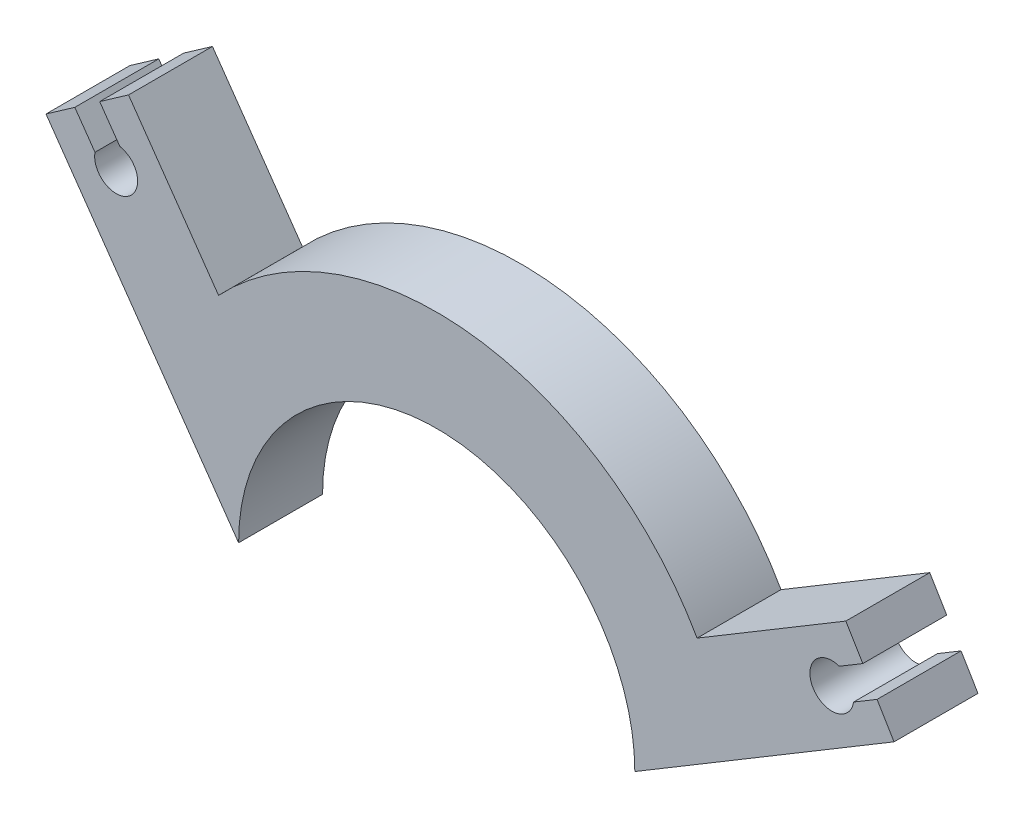
ISO-10303-21;
HEADER;
FILE_DESCRIPTION(('STEP AP214'),'2;1');
FILE_NAME('part.step','',(''),(''),'','','');
FILE_SCHEMA(('AUTOMOTIVE_DESIGN { 1 0 10303 214 1 1 1 1 }'));
ENDSEC;
DATA;
#1=APPLICATION_CONTEXT('core data for automotive mechanical design processes');
#2=APPLICATION_PROTOCOL_DEFINITION('international standard','automotive_design',2000,#1);
#3=PRODUCT_CONTEXT('',#1,'mechanical');
#4=PRODUCT('Part','Part','',(#3));
#5=PRODUCT_RELATED_PRODUCT_CATEGORY('part','',(#4));
#6=PRODUCT_DEFINITION_FORMATION('','',#4);
#7=PRODUCT_DEFINITION_CONTEXT('part definition',#1,'design');
#8=PRODUCT_DEFINITION('design','',#6,#7);
#9=PRODUCT_DEFINITION_SHAPE('','',#8);
#10=(LENGTH_UNIT() NAMED_UNIT(*) SI_UNIT(.MILLI.,.METRE.));
#11=(NAMED_UNIT(*) PLANE_ANGLE_UNIT() SI_UNIT($,.RADIAN.));
#12=(NAMED_UNIT(*) SI_UNIT($,.STERADIAN.) SOLID_ANGLE_UNIT());
#13=UNCERTAINTY_MEASURE_WITH_UNIT(LENGTH_MEASURE(1.E-05),#10,'distance_accuracy_value','');
#14=(GEOMETRIC_REPRESENTATION_CONTEXT(3) GLOBAL_UNCERTAINTY_ASSIGNED_CONTEXT((#13)) GLOBAL_UNIT_ASSIGNED_CONTEXT((#10,
#11,#12)) REPRESENTATION_CONTEXT('',''));
#15=CARTESIAN_POINT('',(0.,0.,0.));
#16=DIRECTION('',(0.,0.,1.));
#17=DIRECTION('',(1.,0.,0.));
#18=AXIS2_PLACEMENT_3D('',#15,#16,#17);
#19=CARTESIAN_POINT('',(0.,0.,1.5875));
#20=DIRECTION('',(0.,0.,-1.));
#21=DIRECTION('',(-1.,0.,0.));
#22=AXIS2_PLACEMENT_3D('',#19,#20,#21);
#23=CYLINDRICAL_SURFACE('',#22,3.7465);
#24=CARTESIAN_POINT('',(0.,0.,0.));
#25=DIRECTION('',(0.,0.,-1.));
#26=DIRECTION('',(1.,0.,0.));
#27=AXIS2_PLACEMENT_3D('',#24,#25,#26);
#28=CIRCLE('',#27,3.7465);
#29=CARTESIAN_POINT('',(-3.7465,0.,0.));
#30=VERTEX_POINT('',#29);
#31=CARTESIAN_POINT('',(3.7465,0.,0.));
#32=VERTEX_POINT('',#31);
#33=EDGE_CURVE('E301',#30,#32,#28,.T.);
#34=ORIENTED_EDGE('',*,*,#33,.T.);
#35=DIRECTION('',(0.,0.,-1.));
#36=VECTOR('',#35,1.);
#37=CARTESIAN_POINT('',(3.7465,0.,1.5875));
#38=LINE('',#37,#36);
#39=CARTESIAN_POINT('',(3.7465,0.,1.5875));
#40=VERTEX_POINT('',#39);
#41=EDGE_CURVE('E12',#40,#32,#38,.T.);
#42=ORIENTED_EDGE('',*,*,#41,.F.);
#43=CARTESIAN_POINT('',(0.,0.,1.5875));
#44=DIRECTION('',(0.,0.,-1.));
#45=DIRECTION('',(1.,0.,0.));
#46=AXIS2_PLACEMENT_3D('',#43,#44,#45);
#47=CIRCLE('',#46,3.7465);
#48=CARTESIAN_POINT('',(-3.7465,0.,1.5875));
#49=VERTEX_POINT('',#48);
#50=EDGE_CURVE('E242',#49,#40,#47,.T.);
#51=ORIENTED_EDGE('',*,*,#50,.F.);
#52=DIRECTION('',(0.,0.,-1.));
#53=VECTOR('',#52,1.);
#54=CARTESIAN_POINT('',(-3.7465,0.,1.5875));
#55=LINE('',#54,#53);
#56=EDGE_CURVE('E179',#49,#30,#55,.T.);
#57=ORIENTED_EDGE('',*,*,#56,.T.);
#58=EDGE_LOOP('',(#34,#42,#51,#57));
#59=FACE_BOUND('',#58,.T.);
#60=ADVANCED_FACE('F36',(#59),#23,.F.);
#61=CARTESIAN_POINT('',(3.7465,0.,1.5875));
#62=DIRECTION('',(-0.51400178949124,0.857789111844982,0.));
#63=DIRECTION('',(-0.857789111844982,-0.51400178949124,0.));
#64=AXIS2_PLACEMENT_3D('',#61,#62,#63);
#65=PLANE('',#64);
#66=DIRECTION('',(0.857789111844982,0.51400178949124,0.));
#67=VECTOR('',#66,1.);
#68=CARTESIAN_POINT('',(3.7465,0.,0.));
#69=LINE('',#68,#67);
#70=CARTESIAN_POINT('',(8.64876477419407,2.93752022694244,0.));
#71=VERTEX_POINT('',#70);
#72=EDGE_CURVE('E295',#32,#71,#69,.T.);
#73=ORIENTED_EDGE('',*,*,#72,.T.);
#74=DIRECTION('',(0.,0.,-1.));
#75=VECTOR('',#74,1.);
#76=CARTESIAN_POINT('',(8.64876477419407,2.93752022694244,1.5875));
#77=LINE('',#76,#75);
#78=CARTESIAN_POINT('',(8.64876477419407,2.93752022694244,1.5875));
#79=VERTEX_POINT('',#78);
#80=EDGE_CURVE('E44',#79,#71,#77,.T.);
#81=ORIENTED_EDGE('',*,*,#80,.F.);
#82=DIRECTION('',(0.857789111844982,0.51400178949124,0.));
#83=VECTOR('',#82,1.);
#84=CARTESIAN_POINT('',(3.7465,0.,1.5875));
#85=LINE('',#84,#83);
#86=EDGE_CURVE('E119',#40,#79,#85,.T.);
#87=ORIENTED_EDGE('',*,*,#86,.F.);
#88=ORIENTED_EDGE('',*,*,#41,.T.);
#89=EDGE_LOOP('',(#73,#81,#87,#88));
#90=FACE_BOUND('',#89,.T.);
#91=ADVANCED_FACE('F338',(#90),#65,.F.);
#92=CARTESIAN_POINT('',(8.64876477419407,2.93752022694244,1.5875));
#93=DIRECTION('',(-0.857789111844981,-0.514001789491241,0.));
#94=DIRECTION('',(0.514001789491241,-0.857789111844981,0.));
#95=AXIS2_PLACEMENT_3D('',#92,#93,#94);
#96=PLANE('',#95);
#97=DIRECTION('',(-0.514001789491241,0.857789111844981,0.));
#98=VECTOR('',#97,1.);
#99=CARTESIAN_POINT('',(8.64876477419407,2.93752022694244,0.));
#100=LINE('',#99,#98);
#101=CARTESIAN_POINT('',(8.32784963015071,3.4730777328006,0.));
#102=VERTEX_POINT('',#101);
#103=EDGE_CURVE('E290',#71,#102,#100,.T.);
#104=ORIENTED_EDGE('',*,*,#103,.T.);
#105=DIRECTION('',(0.,0.,-1.));
#106=VECTOR('',#105,1.);
#107=CARTESIAN_POINT('',(8.32784963015071,3.4730777328006,1.5875));
#108=LINE('',#107,#106);
#109=CARTESIAN_POINT('',(8.32784963015071,3.4730777328006,1.5875));
#110=VERTEX_POINT('',#109);
#111=EDGE_CURVE('E282',#110,#102,#108,.T.);
#112=ORIENTED_EDGE('',*,*,#111,.F.);
#113=DIRECTION('',(-0.514001789491241,0.857789111844981,0.));
#114=VECTOR('',#113,1.);
#115=CARTESIAN_POINT('',(8.64876477419407,2.93752022694244,1.5875));
#116=LINE('',#115,#114);
#117=EDGE_CURVE('E234',#79,#110,#116,.T.);
#118=ORIENTED_EDGE('',*,*,#117,.F.);
#119=ORIENTED_EDGE('',*,*,#80,.T.);
#120=EDGE_LOOP('',(#104,#112,#118,#119));
#121=FACE_BOUND('',#120,.T.);
#122=ADVANCED_FACE('F288',(#121),#96,.F.);
#123=CARTESIAN_POINT('',(8.32784963015071,3.4730777328006,1.5875));
#124=DIRECTION('',(0.514001789491243,-0.85778911184498,0.));
#125=DIRECTION('',(0.85778911184498,0.514001789491243,0.));
#126=AXIS2_PLACEMENT_3D('',#123,#124,#125);
#127=PLANE('',#126);
#128=DIRECTION('',(-0.85778911184498,-0.514001789491243,0.));
#129=VECTOR('',#128,1.);
#130=CARTESIAN_POINT('',(8.32784963015071,3.4730777328006,0.));
#131=LINE('',#130,#129);
#132=CARTESIAN_POINT('',(7.88298717588792,3.20650860245023,0.));
#133=VERTEX_POINT('',#132);
#134=EDGE_CURVE('E297',#102,#133,#131,.T.);
#135=ORIENTED_EDGE('',*,*,#134,.T.);
#136=DIRECTION('',(0.,0.,-1.));
#137=VECTOR('',#136,1.);
#138=CARTESIAN_POINT('',(7.88298717588792,3.20650860245023,1.5875));
#139=LINE('',#138,#137);
#140=CARTESIAN_POINT('',(7.88298717588792,3.20650860245023,1.5875));
#141=VERTEX_POINT('',#140);
#142=EDGE_CURVE('E279',#141,#133,#139,.T.);
#143=ORIENTED_EDGE('',*,*,#142,.F.);
#144=DIRECTION('',(-0.85778911184498,-0.514001789491243,0.));
#145=VECTOR('',#144,1.);
#146=CARTESIAN_POINT('',(8.32784963015071,3.4730777328006,1.5875));
#147=LINE('',#146,#145);
#148=EDGE_CURVE('E230',#110,#141,#147,.T.);
#149=ORIENTED_EDGE('',*,*,#148,.F.);
#150=ORIENTED_EDGE('',*,*,#111,.T.);
#151=EDGE_LOOP('',(#135,#143,#149,#150));
#152=FACE_BOUND('',#151,.T.);
#153=ADVANCED_FACE('F345',(#152),#127,.F.);
#154=CARTESIAN_POINT('',(7.47262979513493,3.26709872392423,1.5875));
#155=DIRECTION('',(0.,0.,-1.));
#156=DIRECTION('',(-1.,0.,0.));
#157=AXIS2_PLACEMENT_3D('',#154,#155,#156);
#158=CYLINDRICAL_SURFACE('',#157,0.414806391897093);
#159=CARTESIAN_POINT('',(7.47262979513493,3.26709872392423,0.));
#160=DIRECTION('',(0.,0.,-1.));
#161=DIRECTION('',(1.,0.,0.));
#162=AXIS2_PLACEMENT_3D('',#159,#160,#161);
#163=CIRCLE('',#162,0.414806391897093);
#164=CARTESIAN_POINT('',(7.61272711717027,3.65753064259536,0.));
#165=VERTEX_POINT('',#164);
#166=EDGE_CURVE('E299',#133,#165,#163,.T.);
#167=ORIENTED_EDGE('',*,*,#166,.T.);
#168=DIRECTION('',(0.,0.,-1.));
#169=VECTOR('',#168,1.);
#170=CARTESIAN_POINT('',(7.61272711717027,3.65753064259536,1.5875));
#171=LINE('',#170,#169);
#172=CARTESIAN_POINT('',(7.61272711717027,3.65753064259536,1.5875));
#173=VERTEX_POINT('',#172);
#174=EDGE_CURVE('E276',#173,#165,#171,.T.);
#175=ORIENTED_EDGE('',*,*,#174,.F.);
#176=CARTESIAN_POINT('',(7.47262979513493,3.26709872392423,1.5875));
#177=DIRECTION('',(0.,0.,-1.));
#178=DIRECTION('',(1.,0.,0.));
#179=AXIS2_PLACEMENT_3D('',#176,#177,#178);
#180=CIRCLE('',#179,0.414806391897093);
#181=EDGE_CURVE('E227',#141,#173,#180,.T.);
#182=ORIENTED_EDGE('',*,*,#181,.F.);
#183=ORIENTED_EDGE('',*,*,#142,.T.);
#184=EDGE_LOOP('',(#167,#175,#182,#183));
#185=FACE_BOUND('',#184,.T.);
#186=ADVANCED_FACE('F350',(#185),#158,.F.);
#187=CARTESIAN_POINT('',(8.05758957143306,3.92409977294573,1.5875));
#188=DIRECTION('',(-0.514001789491239,0.857789111844983,0.));
#189=DIRECTION('',(-0.857789111844983,-0.514001789491239,0.));
#190=AXIS2_PLACEMENT_3D('',#187,#188,#189);
#191=PLANE('',#190);
#192=DIRECTION('',(0.857789111844983,0.514001789491239,0.));
#193=VECTOR('',#192,1.);
#194=CARTESIAN_POINT('',(8.05758957143306,3.92409977294573,0.));
#195=LINE('',#194,#193);
#196=CARTESIAN_POINT('',(8.05758957143306,3.92409977294573,0.));
#197=VERTEX_POINT('',#196);
#198=EDGE_CURVE('E305',#165,#197,#195,.T.);
#199=ORIENTED_EDGE('',*,*,#198,.T.);
#200=DIRECTION('',(0.,0.,-1.));
#201=VECTOR('',#200,1.);
#202=CARTESIAN_POINT('',(8.05758957143306,3.92409977294573,1.5875));
#203=LINE('',#202,#201);
#204=CARTESIAN_POINT('',(8.05758957143306,3.92409977294573,1.5875));
#205=VERTEX_POINT('',#204);
#206=EDGE_CURVE('E273',#205,#197,#203,.T.);
#207=ORIENTED_EDGE('',*,*,#206,.F.);
#208=DIRECTION('',(0.857789111844983,0.514001789491239,0.));
#209=VECTOR('',#208,1.);
#210=CARTESIAN_POINT('',(8.05758957143306,3.92409977294573,1.5875));
#211=LINE('',#210,#209);
#212=EDGE_CURVE('E219',#173,#205,#211,.T.);
#213=ORIENTED_EDGE('',*,*,#212,.F.);
#214=ORIENTED_EDGE('',*,*,#174,.T.);
#215=EDGE_LOOP('',(#199,#207,#213,#214));
#216=FACE_BOUND('',#215,.T.);
#217=ADVANCED_FACE('F354',(#216),#191,.F.);
#218=CARTESIAN_POINT('',(8.05758957143306,3.92409977294573,1.5875));
#219=DIRECTION('',(-0.857789111844982,-0.514001789491241,0.));
#220=DIRECTION('',(0.514001789491241,-0.857789111844982,0.));
#221=AXIS2_PLACEMENT_3D('',#218,#219,#220);
#222=PLANE('',#221);
#223=DIRECTION('',(-0.514001789491241,0.857789111844982,0.));
#224=VECTOR('',#223,1.);
#225=CARTESIAN_POINT('',(8.05758957143306,3.92409977294573,0.));
#226=LINE('',#225,#224);
#227=CARTESIAN_POINT('',(7.73667442738969,4.4596572788039,0.));
#228=VERTEX_POINT('',#227);
#229=EDGE_CURVE('E307',#197,#228,#226,.T.);
#230=ORIENTED_EDGE('',*,*,#229,.T.);
#231=DIRECTION('',(0.,0.,-1.));
#232=VECTOR('',#231,1.);
#233=CARTESIAN_POINT('',(7.73667442738969,4.4596572788039,1.5875));
#234=LINE('',#233,#232);
#235=CARTESIAN_POINT('',(7.73667442738969,4.4596572788039,1.5875));
#236=VERTEX_POINT('',#235);
#237=EDGE_CURVE('E270',#236,#228,#234,.T.);
#238=ORIENTED_EDGE('',*,*,#237,.F.);
#239=DIRECTION('',(-0.514001789491241,0.857789111844982,0.));
#240=VECTOR('',#239,1.);
#241=CARTESIAN_POINT('',(8.05758957143306,3.92409977294573,1.5875));
#242=LINE('',#241,#240);
#243=EDGE_CURVE('E215',#205,#236,#242,.T.);
#244=ORIENTED_EDGE('',*,*,#243,.F.);
#245=ORIENTED_EDGE('',*,*,#206,.T.);
#246=EDGE_LOOP('',(#230,#238,#244,#245));
#247=FACE_BOUND('',#246,.T.);
#248=ADVANCED_FACE('F358',(#247),#222,.F.);
#249=CARTESIAN_POINT('',(7.73667442738969,4.4596572788039,1.5875));
#250=DIRECTION('',(0.514001789491241,-0.857789111844982,0.));
#251=DIRECTION('',(0.857789111844982,0.514001789491241,0.));
#252=AXIS2_PLACEMENT_3D('',#249,#250,#251);
#253=PLANE('',#252);
#254=DIRECTION('',(-0.857789111844982,-0.514001789491241,0.));
#255=VECTOR('',#254,1.);
#256=CARTESIAN_POINT('',(7.73667442738969,4.4596572788039,0.));
#257=LINE('',#256,#255);
#258=CARTESIAN_POINT('',(4.92378631338093,2.77412699604084,0.));
#259=VERTEX_POINT('',#258);
#260=EDGE_CURVE('E309',#228,#259,#257,.T.);
#261=ORIENTED_EDGE('',*,*,#260,.T.);
#262=DIRECTION('',(0.,0.,-1.));
#263=VECTOR('',#262,1.);
#264=CARTESIAN_POINT('',(4.92378631338093,2.77412699604084,1.5875));
#265=LINE('',#264,#263);
#266=CARTESIAN_POINT('',(4.92378631338093,2.77412699604084,1.5875));
#267=VERTEX_POINT('',#266);
#268=EDGE_CURVE('E267',#267,#259,#265,.T.);
#269=ORIENTED_EDGE('',*,*,#268,.F.);
#270=DIRECTION('',(-0.857789111844982,-0.514001789491241,0.));
#271=VECTOR('',#270,1.);
#272=CARTESIAN_POINT('',(7.73667442738969,4.4596572788039,1.5875));
#273=LINE('',#272,#271);
#274=EDGE_CURVE('E211',#236,#267,#273,.T.);
#275=ORIENTED_EDGE('',*,*,#274,.F.);
#276=ORIENTED_EDGE('',*,*,#237,.T.);
#277=EDGE_LOOP('',(#261,#269,#275,#276));
#278=FACE_BOUND('',#277,.T.);
#279=ADVANCED_FACE('F362',(#278),#253,.F.);
#280=CARTESIAN_POINT('',(0.,0.,1.5875));
#281=DIRECTION('',(0.,0.,-1.));
#282=DIRECTION('',(-1.,0.,0.));
#283=AXIS2_PLACEMENT_3D('',#280,#281,#282);
#284=CYLINDRICAL_SURFACE('',#283,5.6515);
#285=CARTESIAN_POINT('',(0.,0.,0.));
#286=DIRECTION('',(0.,0.,1.));
#287=DIRECTION('',(1.,0.,0.));
#288=AXIS2_PLACEMENT_3D('',#285,#286,#287);
#289=CIRCLE('',#288,5.6515);
#290=CARTESIAN_POINT('',(-4.12552754892723,3.86257358415894,0.));
#291=VERTEX_POINT('',#290);
#292=EDGE_CURVE('E311',#259,#291,#289,.T.);
#293=ORIENTED_EDGE('',*,*,#292,.T.);
#294=DIRECTION('',(0.,0.,-1.));
#295=VECTOR('',#294,1.);
#296=CARTESIAN_POINT('',(-4.12552754892723,3.86257358415894,1.5875));
#297=LINE('',#296,#295);
#298=CARTESIAN_POINT('',(-4.12552754892723,3.86257358415894,1.5875));
#299=VERTEX_POINT('',#298);
#300=EDGE_CURVE('E264',#299,#291,#297,.T.);
#301=ORIENTED_EDGE('',*,*,#300,.F.);
#302=CARTESIAN_POINT('',(0.,0.,1.5875));
#303=DIRECTION('',(0.,0.,1.));
#304=DIRECTION('',(1.,0.,0.));
#305=AXIS2_PLACEMENT_3D('',#302,#303,#304);
#306=CIRCLE('',#305,5.6515);
#307=EDGE_CURVE('E208',#267,#299,#306,.T.);
#308=ORIENTED_EDGE('',*,*,#307,.F.);
#309=ORIENTED_EDGE('',*,*,#268,.T.);
#310=EDGE_LOOP('',(#293,#301,#308,#309));
#311=FACE_BOUND('',#310,.T.);
#312=ADVANCED_FACE('F366',(#311),#284,.T.);
#313=CARTESIAN_POINT('',(-5.82822572645865,6.29427859248383,1.5875));
#314=DIRECTION('',(-0.819152044288988,-0.573576436351051,0.));
#315=DIRECTION('',(0.573576436351051,-0.819152044288988,0.));
#316=AXIS2_PLACEMENT_3D('',#313,#314,#315);
#317=PLANE('',#316);
#318=DIRECTION('',(-0.573576436351051,0.819152044288988,0.));
#319=VECTOR('',#318,1.);
#320=CARTESIAN_POINT('',(-5.82822572645865,6.29427859248383,0.));
#321=LINE('',#320,#319);
#322=CARTESIAN_POINT('',(-5.82822572645865,6.29427859248383,0.));
#323=VERTEX_POINT('',#322);
#324=EDGE_CURVE('E313',#291,#323,#321,.T.);
#325=ORIENTED_EDGE('',*,*,#324,.T.);
#326=DIRECTION('',(0.,0.,-1.));
#327=VECTOR('',#326,1.);
#328=CARTESIAN_POINT('',(-5.82822572645865,6.29427859248383,1.5875));
#329=LINE('',#328,#327);
#330=CARTESIAN_POINT('',(-5.82822572645865,6.29427859248383,1.5875));
#331=VERTEX_POINT('',#330);
#332=EDGE_CURVE('E261',#331,#323,#329,.T.);
#333=ORIENTED_EDGE('',*,*,#332,.F.);
#334=DIRECTION('',(-0.573576436351051,0.819152044288988,0.));
#335=VECTOR('',#334,1.);
#336=CARTESIAN_POINT('',(-5.82822572645865,6.29427859248383,1.5875));
#337=LINE('',#336,#335);
#338=EDGE_CURVE('E200',#299,#331,#337,.T.);
#339=ORIENTED_EDGE('',*,*,#338,.F.);
#340=ORIENTED_EDGE('',*,*,#300,.T.);
#341=EDGE_LOOP('',(#325,#333,#339,#340));
#342=FACE_BOUND('',#341,.T.);
#343=ADVANCED_FACE('F370',(#342),#317,.F.);
#344=CARTESIAN_POINT('',(-6.3730698035299,5.91277466256962,1.5875));
#345=DIRECTION('',(0.573576436351051,-0.819152044288989,0.));
#346=DIRECTION('',(0.819152044288989,0.573576436351051,0.));
#347=AXIS2_PLACEMENT_3D('',#344,#345,#346);
#348=PLANE('',#347);
#349=DIRECTION('',(-0.819152044288989,-0.573576436351051,0.));
#350=VECTOR('',#349,1.);
#351=CARTESIAN_POINT('',(-6.3730698035299,5.91277466256962,0.));
#352=LINE('',#351,#350);
#353=CARTESIAN_POINT('',(-6.3730698035299,5.91277466256962,0.));
#354=VERTEX_POINT('',#353);
#355=EDGE_CURVE('E315',#323,#354,#352,.T.);
#356=ORIENTED_EDGE('',*,*,#355,.T.);
#357=DIRECTION('',(0.,0.,-1.));
#358=VECTOR('',#357,1.);
#359=CARTESIAN_POINT('',(-6.3730698035299,5.91277466256962,1.5875));
#360=LINE('',#359,#358);
#361=CARTESIAN_POINT('',(-6.3730698035299,5.91277466256962,1.5875));
#362=VERTEX_POINT('',#361);
#363=EDGE_CURVE('E258',#362,#354,#360,.T.);
#364=ORIENTED_EDGE('',*,*,#363,.F.);
#365=DIRECTION('',(-0.819152044288989,-0.573576436351051,0.));
#366=VECTOR('',#365,1.);
#367=CARTESIAN_POINT('',(-6.3730698035299,5.91277466256962,1.5875));
#368=LINE('',#367,#366);
#369=EDGE_CURVE('E196',#331,#362,#368,.T.);
#370=ORIENTED_EDGE('',*,*,#369,.F.);
#371=ORIENTED_EDGE('',*,*,#332,.T.);
#372=EDGE_LOOP('',(#356,#364,#370,#371));
#373=FACE_BOUND('',#372,.T.);
#374=ADVANCED_FACE('F374',(#373),#348,.F.);
#375=CARTESIAN_POINT('',(-6.3730698035299,5.91277466256962,1.5875));
#376=DIRECTION('',(0.81915204428899,0.573576436351048,0.));
#377=DIRECTION('',(-0.573576436351048,0.81915204428899,0.));
#378=AXIS2_PLACEMENT_3D('',#375,#376,#377);
#379=PLANE('',#378);
#380=DIRECTION('',(0.573576436351048,-0.81915204428899,0.));
#381=VECTOR('',#380,1.);
#382=CARTESIAN_POINT('',(-6.3730698035299,5.91277466256962,0.));
#383=LINE('',#382,#381);
#384=CARTESIAN_POINT('',(-5.99156587361569,5.36793058549836,0.));
#385=VERTEX_POINT('',#384);
#386=EDGE_CURVE('E317',#354,#385,#383,.T.);
#387=ORIENTED_EDGE('',*,*,#386,.T.);
#388=DIRECTION('',(0.,0.,-1.));
#389=VECTOR('',#388,1.);
#390=CARTESIAN_POINT('',(-5.99156587361569,5.36793058549836,1.5875));
#391=LINE('',#390,#389);
#392=CARTESIAN_POINT('',(-5.99156587361569,5.36793058549836,1.5875));
#393=VERTEX_POINT('',#392);
#394=EDGE_CURVE('E255',#393,#385,#391,.T.);
#395=ORIENTED_EDGE('',*,*,#394,.F.);
#396=DIRECTION('',(0.573576436351048,-0.81915204428899,0.));
#397=VECTOR('',#396,1.);
#398=CARTESIAN_POINT('',(-6.3730698035299,5.91277466256962,1.5875));
#399=LINE('',#398,#397);
#400=EDGE_CURVE('E192',#362,#393,#399,.T.);
#401=ORIENTED_EDGE('',*,*,#400,.F.);
#402=ORIENTED_EDGE('',*,*,#363,.T.);
#403=EDGE_LOOP('',(#387,#395,#401,#402));
#404=FACE_BOUND('',#403,.T.);
#405=ADVANCED_FACE('F378',(#404),#379,.F.);
#406=CARTESIAN_POINT('',(-6.06213649301953,4.96770471467419,1.5875));
#407=DIRECTION('',(0.,0.,-1.));
#408=DIRECTION('',(-1.,0.,0.));
#409=AXIS2_PLACEMENT_3D('',#406,#407,#408);
#410=CYLINDRICAL_SURFACE('',#409,0.4064);
#411=CARTESIAN_POINT('',(-6.06213649301953,4.96770471467419,0.));
#412=DIRECTION('',(0.,0.,-1.));
#413=DIRECTION('',(1.,0.,0.));
#414=AXIS2_PLACEMENT_3D('',#411,#412,#413);
#415=CIRCLE('',#414,0.4064);
#416=CARTESIAN_POINT('',(-6.46236236384369,5.03827533407803,0.));
#417=VERTEX_POINT('',#416);
#418=EDGE_CURVE('E319',#385,#417,#415,.T.);
#419=ORIENTED_EDGE('',*,*,#418,.T.);
#420=DIRECTION('',(0.,0.,-1.));
#421=VECTOR('',#420,1.);
#422=CARTESIAN_POINT('',(-6.46236236384369,5.03827533407803,1.5875));
#423=LINE('',#422,#421);
#424=CARTESIAN_POINT('',(-6.46236236384369,5.03827533407803,1.5875));
#425=VERTEX_POINT('',#424);
#426=EDGE_CURVE('E172',#425,#417,#423,.T.);
#427=ORIENTED_EDGE('',*,*,#426,.F.);
#428=CARTESIAN_POINT('',(-6.06213649301953,4.96770471467419,1.5875));
#429=DIRECTION('',(0.,0.,-1.));
#430=DIRECTION('',(1.,0.,0.));
#431=AXIS2_PLACEMENT_3D('',#428,#429,#430);
#432=CIRCLE('',#431,0.4064);
#433=EDGE_CURVE('E162',#393,#425,#432,.T.);
#434=ORIENTED_EDGE('',*,*,#433,.F.);
#435=ORIENTED_EDGE('',*,*,#394,.T.);
#436=EDGE_LOOP('',(#419,#427,#434,#435));
#437=FACE_BOUND('',#436,.T.);
#438=ADVANCED_FACE('F322',(#437),#410,.F.);
#439=CARTESIAN_POINT('',(-6.8438662937579,5.58311941114929,1.5875));
#440=DIRECTION('',(-0.819152044288989,-0.57357643635105,0.));
#441=DIRECTION('',(0.57357643635105,-0.819152044288989,0.));
#442=AXIS2_PLACEMENT_3D('',#439,#440,#441);
#443=PLANE('',#442);
#444=DIRECTION('',(-0.57357643635105,0.819152044288989,0.));
#445=VECTOR('',#444,1.);
#446=CARTESIAN_POINT('',(-6.8438662937579,5.58311941114929,0.));
#447=LINE('',#446,#445);
#448=CARTESIAN_POINT('',(-6.8438662937579,5.58311941114929,0.));
#449=VERTEX_POINT('',#448);
#450=EDGE_CURVE('E171',#417,#449,#447,.T.);
#451=ORIENTED_EDGE('',*,*,#450,.T.);
#452=DIRECTION('',(0.,0.,-1.));
#453=VECTOR('',#452,1.);
#454=CARTESIAN_POINT('',(-6.8438662937579,5.58311941114929,1.5875));
#455=LINE('',#454,#453);
#456=CARTESIAN_POINT('',(-6.8438662937579,5.58311941114929,1.5875));
#457=VERTEX_POINT('',#456);
#458=EDGE_CURVE('E168',#457,#449,#455,.T.);
#459=ORIENTED_EDGE('',*,*,#458,.F.);
#460=DIRECTION('',(-0.57357643635105,0.819152044288989,0.));
#461=VECTOR('',#460,1.);
#462=CARTESIAN_POINT('',(-6.8438662937579,5.58311941114929,1.5875));
#463=LINE('',#462,#461);
#464=EDGE_CURVE('E156',#425,#457,#463,.T.);
#465=ORIENTED_EDGE('',*,*,#464,.F.);
#466=ORIENTED_EDGE('',*,*,#426,.T.);
#467=EDGE_LOOP('',(#451,#459,#465,#466));
#468=FACE_BOUND('',#467,.T.);
#469=ADVANCED_FACE('F169',(#468),#443,.F.);
#470=CARTESIAN_POINT('',(-7.38871037082917,5.20161548123508,1.5875));
#471=DIRECTION('',(0.57357643635105,-0.819152044288989,0.));
#472=DIRECTION('',(0.819152044288989,0.57357643635105,0.));
#473=AXIS2_PLACEMENT_3D('',#470,#471,#472);
#474=PLANE('',#473);
#475=DIRECTION('',(-0.819152044288989,-0.57357643635105,0.));
#476=VECTOR('',#475,1.);
#477=CARTESIAN_POINT('',(-7.38871037082917,5.20161548123508,0.));
#478=LINE('',#477,#476);
#479=CARTESIAN_POINT('',(-7.38871037082917,5.20161548123508,0.));
#480=VERTEX_POINT('',#479);
#481=EDGE_CURVE('E105',#449,#480,#478,.T.);
#482=ORIENTED_EDGE('',*,*,#481,.T.);
#483=DIRECTION('',(0.,0.,-1.));
#484=VECTOR('',#483,1.);
#485=CARTESIAN_POINT('',(-7.38871037082917,5.20161548123508,1.5875));
#486=LINE('',#485,#484);
#487=CARTESIAN_POINT('',(-7.38871037082917,5.20161548123508,1.5875));
#488=VERTEX_POINT('',#487);
#489=EDGE_CURVE('E173',#488,#480,#486,.T.);
#490=ORIENTED_EDGE('',*,*,#489,.F.);
#491=DIRECTION('',(-0.819152044288989,-0.57357643635105,0.));
#492=VECTOR('',#491,1.);
#493=CARTESIAN_POINT('',(-7.38871037082917,5.20161548123508,1.5875));
#494=LINE('',#493,#492);
#495=EDGE_CURVE('E160',#457,#488,#494,.T.);
#496=ORIENTED_EDGE('',*,*,#495,.F.);
#497=ORIENTED_EDGE('',*,*,#458,.T.);
#498=EDGE_LOOP('',(#482,#490,#496,#497));
#499=FACE_BOUND('',#498,.T.);
#500=ADVANCED_FACE('F175',(#499),#474,.F.);
#501=CARTESIAN_POINT('',(-3.7465,0.,1.5875));
#502=DIRECTION('',(0.819152044288989,0.57357643635105,0.));
#503=DIRECTION('',(-0.57357643635105,0.819152044288989,0.));
#504=AXIS2_PLACEMENT_3D('',#501,#502,#503);
#505=PLANE('',#504);
#506=DIRECTION('',(0.57357643635105,-0.819152044288989,0.));
#507=VECTOR('',#506,1.);
#508=CARTESIAN_POINT('',(-3.7465,0.,0.));
#509=LINE('',#508,#507);
#510=EDGE_CURVE('E111',#480,#30,#509,.T.);
#511=ORIENTED_EDGE('',*,*,#510,.T.);
#512=ORIENTED_EDGE('',*,*,#56,.F.);
#513=DIRECTION('',(0.57357643635105,-0.819152044288989,0.));
#514=VECTOR('',#513,1.);
#515=CARTESIAN_POINT('',(-3.7465,0.,1.5875));
#516=LINE('',#515,#514);
#517=EDGE_CURVE('E52',#488,#49,#516,.T.);
#518=ORIENTED_EDGE('',*,*,#517,.F.);
#519=ORIENTED_EDGE('',*,*,#489,.T.);
#520=EDGE_LOOP('',(#511,#512,#518,#519));
#521=FACE_BOUND('',#520,.T.);
#522=ADVANCED_FACE('F327',(#521),#505,.F.);
#523=CARTESIAN_POINT('',(0.,0.,1.5875));
#524=DIRECTION('',(0.,0.,1.));
#525=DIRECTION('',(1.,0.,0.));
#526=AXIS2_PLACEMENT_3D('',#523,#524,#525);
#527=PLANE('',#526);
#528=ORIENTED_EDGE('',*,*,#50,.T.);
#529=ORIENTED_EDGE('',*,*,#86,.T.);
#530=ORIENTED_EDGE('',*,*,#117,.T.);
#531=ORIENTED_EDGE('',*,*,#148,.T.);
#532=ORIENTED_EDGE('',*,*,#181,.T.);
#533=ORIENTED_EDGE('',*,*,#212,.T.);
#534=ORIENTED_EDGE('',*,*,#243,.T.);
#535=ORIENTED_EDGE('',*,*,#274,.T.);
#536=ORIENTED_EDGE('',*,*,#307,.T.);
#537=ORIENTED_EDGE('',*,*,#338,.T.);
#538=ORIENTED_EDGE('',*,*,#369,.T.);
#539=ORIENTED_EDGE('',*,*,#400,.T.);
#540=ORIENTED_EDGE('',*,*,#433,.T.);
#541=ORIENTED_EDGE('',*,*,#464,.T.);
#542=ORIENTED_EDGE('',*,*,#495,.T.);
#543=ORIENTED_EDGE('',*,*,#517,.T.);
#544=EDGE_LOOP('',(#528,#529,#530,#531,#532,#533,#534,#535,#536,#537,#538,#539,#540,#541,#542,#543));
#545=FACE_BOUND('',#544,.T.);
#546=ADVANCED_FACE('F158',(#545),#527,.T.);
#547=CARTESIAN_POINT('',(0.,0.,0.));
#548=DIRECTION('',(0.,0.,1.));
#549=DIRECTION('',(1.,0.,0.));
#550=AXIS2_PLACEMENT_3D('',#547,#548,#549);
#551=PLANE('',#550);
#552=ORIENTED_EDGE('',*,*,#33,.F.);
#553=ORIENTED_EDGE('',*,*,#510,.F.);
#554=ORIENTED_EDGE('',*,*,#481,.F.);
#555=ORIENTED_EDGE('',*,*,#450,.F.);
#556=ORIENTED_EDGE('',*,*,#418,.F.);
#557=ORIENTED_EDGE('',*,*,#386,.F.);
#558=ORIENTED_EDGE('',*,*,#355,.F.);
#559=ORIENTED_EDGE('',*,*,#324,.F.);
#560=ORIENTED_EDGE('',*,*,#292,.F.);
#561=ORIENTED_EDGE('',*,*,#260,.F.);
#562=ORIENTED_EDGE('',*,*,#229,.F.);
#563=ORIENTED_EDGE('',*,*,#198,.F.);
#564=ORIENTED_EDGE('',*,*,#166,.F.);
#565=ORIENTED_EDGE('',*,*,#134,.F.);
#566=ORIENTED_EDGE('',*,*,#103,.F.);
#567=ORIENTED_EDGE('',*,*,#72,.F.);
#568=EDGE_LOOP('',(#552,#553,#554,#555,#556,#557,#558,#559,#560,#561,#562,#563,#564,#565,#566,#567));
#569=FACE_BOUND('',#568,.T.);
#570=ADVANCED_FACE('F294',(#569),#551,.F.);
#571=CLOSED_SHELL('',(#60,#91,#122,#153,#186,#217,#248,#279,#312,#343,#374,#405,#438,#469,#500,
#522,#546,#570));
#572=MANIFOLD_SOLID_BREP('B2',#571);
#573=ADVANCED_BREP_SHAPE_REPRESENTATION('',(#18,#572),#14);
#574=SHAPE_DEFINITION_REPRESENTATION(#9,#573);
ENDSEC;
END-ISO-10303-21;
